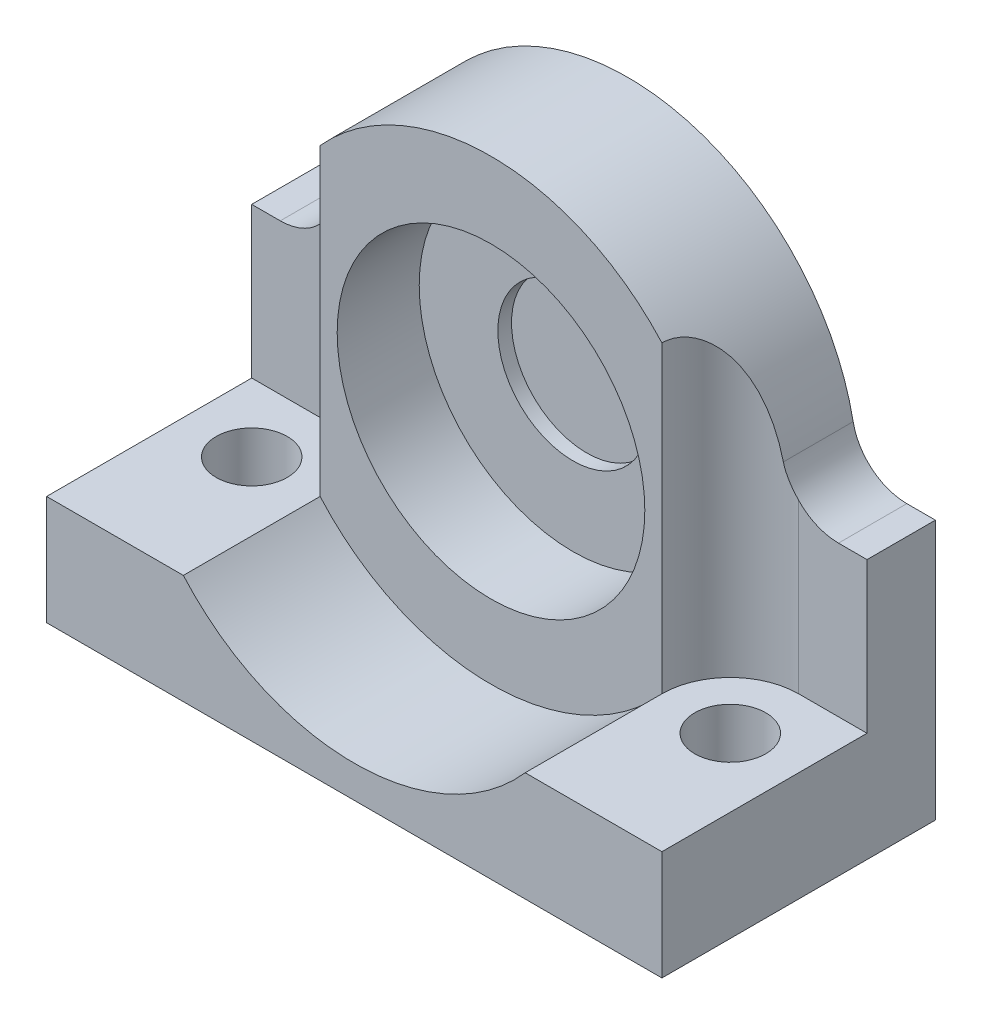
ISO-10303-21;
HEADER;
FILE_DESCRIPTION(('STEP AP214'),'2;1');
FILE_NAME('part.step','',(''),(''),'','','');
FILE_SCHEMA(('AUTOMOTIVE_DESIGN { 1 0 10303 214 1 1 1 1 }'));
ENDSEC;
DATA;
#1=APPLICATION_CONTEXT('core data for automotive mechanical design processes');
#2=APPLICATION_PROTOCOL_DEFINITION('international standard','automotive_design',2000,#1);
#3=PRODUCT_CONTEXT('',#1,'mechanical');
#4=PRODUCT('Part','Part','',(#3));
#5=PRODUCT_RELATED_PRODUCT_CATEGORY('part','',(#4));
#6=PRODUCT_DEFINITION_FORMATION('','',#4);
#7=PRODUCT_DEFINITION_CONTEXT('part definition',#1,'design');
#8=PRODUCT_DEFINITION('design','',#6,#7);
#9=PRODUCT_DEFINITION_SHAPE('','',#8);
#10=(LENGTH_UNIT() NAMED_UNIT(*) SI_UNIT(.MILLI.,.METRE.));
#11=(NAMED_UNIT(*) PLANE_ANGLE_UNIT() SI_UNIT($,.RADIAN.));
#12=(NAMED_UNIT(*) SI_UNIT($,.STERADIAN.) SOLID_ANGLE_UNIT());
#13=UNCERTAINTY_MEASURE_WITH_UNIT(LENGTH_MEASURE(1.E-05),#10,'distance_accuracy_value','');
#14=(GEOMETRIC_REPRESENTATION_CONTEXT(3) GLOBAL_UNCERTAINTY_ASSIGNED_CONTEXT((#13)) GLOBAL_UNIT_ASSIGNED_CONTEXT((#10,
#11,#12)) REPRESENTATION_CONTEXT('',''));
#15=CARTESIAN_POINT('',(0.,0.,0.));
#16=DIRECTION('',(0.,0.,1.));
#17=DIRECTION('',(1.,0.,0.));
#18=AXIS2_PLACEMENT_3D('',#15,#16,#17);
#19=CARTESIAN_POINT('',(0.,19.,20.));
#20=DIRECTION('',(0.,0.,1.));
#21=DIRECTION('',(1.,0.,0.));
#22=AXIS2_PLACEMENT_3D('',#19,#20,#21);
#23=PLANE('',#22);
#24=DIRECTION('',(1.,0.,0.));
#25=VECTOR('',#24,1.);
#26=CARTESIAN_POINT('',(-22.5,8.,20.));
#27=LINE('',#26,#25);
#28=CARTESIAN_POINT('',(12.5,8.,20.));
#29=VERTEX_POINT('',#28);
#30=CARTESIAN_POINT('',(22.5,8.,20.));
#31=VERTEX_POINT('',#30);
#32=EDGE_CURVE('E157',#29,#31,#27,.T.);
#33=ORIENTED_EDGE('',*,*,#32,.F.);
#34=CARTESIAN_POINT('',(0.,19.,20.));
#35=DIRECTION('',(0.,0.,1.));
#36=DIRECTION('',(1.,0.,0.));
#37=AXIS2_PLACEMENT_3D('',#34,#35,#36);
#38=CIRCLE('',#37,16.6508258053467);
#39=CARTESIAN_POINT('',(-12.5,8.,20.));
#40=VERTEX_POINT('',#39);
#41=EDGE_CURVE('E141',#40,#29,#38,.T.);
#42=ORIENTED_EDGE('',*,*,#41,.F.);
#43=CARTESIAN_POINT('',(-22.5,8.,20.));
#44=VERTEX_POINT('',#43);
#45=EDGE_CURVE('E167',#44,#40,#27,.T.);
#46=ORIENTED_EDGE('',*,*,#45,.F.);
#47=DIRECTION('',(0.,-1.,0.));
#48=VECTOR('',#47,1.);
#49=CARTESIAN_POINT('',(-22.5,19.,20.));
#50=LINE('',#49,#48);
#51=CARTESIAN_POINT('',(-22.5,0.,20.));
#52=VERTEX_POINT('',#51);
#53=EDGE_CURVE('E182',#44,#52,#50,.T.);
#54=ORIENTED_EDGE('',*,*,#53,.T.);
#55=DIRECTION('',(1.,0.,0.));
#56=VECTOR('',#55,1.);
#57=CARTESIAN_POINT('',(-22.5,0.,20.));
#58=LINE('',#57,#56);
#59=CARTESIAN_POINT('',(22.5,0.,20.));
#60=VERTEX_POINT('',#59);
#61=EDGE_CURVE('E178',#52,#60,#58,.T.);
#62=ORIENTED_EDGE('',*,*,#61,.T.);
#63=DIRECTION('',(0.,1.,0.));
#64=VECTOR('',#63,1.);
#65=CARTESIAN_POINT('',(22.5,0.,20.));
#66=LINE('',#65,#64);
#67=EDGE_CURVE('E166',#60,#31,#66,.T.);
#68=ORIENTED_EDGE('',*,*,#67,.T.);
#69=EDGE_LOOP('',(#33,#42,#46,#54,#62,#68));
#70=FACE_BOUND('',#69,.T.);
#71=ADVANCED_FACE('F35',(#70),#23,.T.);
#72=CARTESIAN_POINT('',(-22.5,8.,10.));
#73=DIRECTION('',(0.,-1.,0.));
#74=DIRECTION('',(0.,0.,-1.));
#75=AXIS2_PLACEMENT_3D('',#72,#73,#74);
#76=PLANE('',#75);
#77=CARTESIAN_POINT('',(-17.5,8.,10.));
#78=DIRECTION('',(0.,1.,0.));
#79=DIRECTION('',(0.,0.,1.));
#80=AXIS2_PLACEMENT_3D('',#77,#78,#79);
#81=CIRCLE('',#80,2.6);
#82=CARTESIAN_POINT('',(-17.5,8.,12.6));
#83=VERTEX_POINT('',#82);
#84=EDGE_CURVE('E331',#83,#83,#81,.T.);
#85=ORIENTED_EDGE('',*,*,#84,.F.);
#86=EDGE_LOOP('',(#85));
#87=FACE_BOUND('',#86,.T.);
#88=DIRECTION('',(0.,0.,-1.));
#89=VECTOR('',#88,1.);
#90=CARTESIAN_POINT('',(-12.5,8.,20.));
#91=LINE('',#90,#89);
#92=CARTESIAN_POINT('',(-12.5,8.,9.99999999999999));
#93=VERTEX_POINT('',#92);
#94=EDGE_CURVE('E147',#40,#93,#91,.T.);
#95=ORIENTED_EDGE('',*,*,#94,.T.);
#96=CARTESIAN_POINT('',(-17.5,8.,10.));
#97=DIRECTION('',(0.,1.,0.));
#98=DIRECTION('',(0.,0.,1.));
#99=AXIS2_PLACEMENT_3D('',#96,#97,#98);
#100=CIRCLE('',#99,5.);
#101=CARTESIAN_POINT('',(-17.5,8.,5.));
#102=VERTEX_POINT('',#101);
#103=EDGE_CURVE('E337',#93,#102,#100,.T.);
#104=ORIENTED_EDGE('',*,*,#103,.T.);
#105=DIRECTION('',(-1.,0.,0.));
#106=VECTOR('',#105,1.);
#107=CARTESIAN_POINT('',(-17.5,8.,5.));
#108=LINE('',#107,#106);
#109=CARTESIAN_POINT('',(-22.5,8.,5.));
#110=VERTEX_POINT('',#109);
#111=EDGE_CURVE('E342',#102,#110,#108,.T.);
#112=ORIENTED_EDGE('',*,*,#111,.T.);
#113=DIRECTION('',(0.,0.,-1.));
#114=VECTOR('',#113,1.);
#115=CARTESIAN_POINT('',(-22.5,8.,10.));
#116=LINE('',#115,#114);
#117=EDGE_CURVE('E168',#44,#110,#116,.T.);
#118=ORIENTED_EDGE('',*,*,#117,.F.);
#119=ORIENTED_EDGE('',*,*,#45,.T.);
#120=EDGE_LOOP('',(#95,#104,#112,#118,#119));
#121=FACE_BOUND('',#120,.T.);
#122=ADVANCED_FACE('F348',(#87,#121),#76,.F.);
#123=CARTESIAN_POINT('',(17.5,8.,10.));
#124=DIRECTION('',(0.,1.,0.));
#125=DIRECTION('',(0.,0.,1.));
#126=AXIS2_PLACEMENT_3D('',#123,#124,#125);
#127=CIRCLE('',#126,2.6);
#128=CARTESIAN_POINT('',(17.5,8.,12.6));
#129=VERTEX_POINT('',#128);
#130=EDGE_CURVE('E162',#129,#129,#127,.T.);
#131=ORIENTED_EDGE('',*,*,#130,.F.);
#132=EDGE_LOOP('',(#131));
#133=FACE_BOUND('',#132,.T.);
#134=DIRECTION('',(0.,0.,-1.));
#135=VECTOR('',#134,1.);
#136=CARTESIAN_POINT('',(12.5,8.,20.));
#137=LINE('',#136,#135);
#138=CARTESIAN_POINT('',(12.5,8.,9.99999999999999));
#139=VERTEX_POINT('',#138);
#140=EDGE_CURVE('E144',#29,#139,#137,.T.);
#141=ORIENTED_EDGE('',*,*,#140,.F.);
#142=ORIENTED_EDGE('',*,*,#32,.T.);
#143=DIRECTION('',(0.,0.,-1.));
#144=VECTOR('',#143,1.);
#145=CARTESIAN_POINT('',(22.5,8.,10.));
#146=LINE('',#145,#144);
#147=CARTESIAN_POINT('',(22.5,8.,5.));
#148=VERTEX_POINT('',#147);
#149=EDGE_CURVE('E171',#31,#148,#146,.T.);
#150=ORIENTED_EDGE('',*,*,#149,.T.);
#151=DIRECTION('',(-1.,0.,0.));
#152=VECTOR('',#151,1.);
#153=CARTESIAN_POINT('',(17.5,8.,5.));
#154=LINE('',#153,#152);
#155=CARTESIAN_POINT('',(17.5,8.,5.));
#156=VERTEX_POINT('',#155);
#157=EDGE_CURVE('E312',#148,#156,#154,.T.);
#158=ORIENTED_EDGE('',*,*,#157,.T.);
#159=CARTESIAN_POINT('',(17.5,8.,10.));
#160=DIRECTION('',(0.,1.,0.));
#161=DIRECTION('',(0.,0.,1.));
#162=AXIS2_PLACEMENT_3D('',#159,#160,#161);
#163=CIRCLE('',#162,5.);
#164=EDGE_CURVE('E160',#156,#139,#163,.T.);
#165=ORIENTED_EDGE('',*,*,#164,.T.);
#166=EDGE_LOOP('',(#141,#142,#150,#158,#165));
#167=FACE_BOUND('',#166,.T.);
#168=ADVANCED_FACE('F156',(#133,#167),#76,.F.);
#169=CARTESIAN_POINT('',(0.,19.,20.));
#170=DIRECTION('',(0.,0.,-1.));
#171=DIRECTION('',(-1.,0.,0.));
#172=AXIS2_PLACEMENT_3D('',#169,#170,#171);
#173=CYLINDRICAL_SURFACE('',#172,16.8);
#174=CARTESIAN_POINT('',(16.8,19.,5.04924248220538));
#175=CARTESIAN_POINT('',(16.8000022174035,19.2106562323187,5.04926310008381));
#176=CARTESIAN_POINT('',(16.7960379302087,19.4213130539046,5.04980344569116));
#177=CARTESIAN_POINT('',(16.7801919407498,19.842327579965,5.05207154890843));
#178=CARTESIAN_POINT('',(16.7683100362199,20.0526852766604,5.05379933685313));
#179=CARTESIAN_POINT('',(16.7366281814743,20.4730057347984,5.05859275035779));
#180=CARTESIAN_POINT('',(16.7168201289396,20.6829678705503,5.06165974518417));
#181=CARTESIAN_POINT('',(16.6693187818816,21.101966557863,5.06942681995495));
#182=CARTESIAN_POINT('',(16.6416255644162,21.3110031184487,5.07412688394026));
#183=CARTESIAN_POINT('',(16.5781207847793,21.7296769905512,5.08561412508738));
#184=CARTESIAN_POINT('',(16.5422395751883,21.9393032590099,5.09241939695503));
#185=CARTESIAN_POINT('',(16.4625670636126,22.3569447297035,5.10864170888744));
#186=CARTESIAN_POINT('',(16.4187758559397,22.5649599511162,5.11805871781288));
#187=CARTESIAN_POINT('',(16.3234000082937,22.9789064119948,5.14016371472516));
#188=CARTESIAN_POINT('',(16.2718196122779,23.1848387215432,5.1528499241236));
#189=CARTESIAN_POINT('',(16.1609800954177,23.5943128957918,5.18229194656679));
#190=CARTESIAN_POINT('',(16.1017216631907,23.7978549730808,5.19904739477279));
#191=CARTESIAN_POINT('',(15.9594439259016,24.2542407808837,5.2425244978682));
#192=CARTESIAN_POINT('',(15.8742368543149,24.5062716426994,5.27070174641411));
#193=CARTESIAN_POINT('',(15.692419866259,25.0048613808331,5.33716569885362));
#194=CARTESIAN_POINT('',(15.5958097034524,25.2514201388023,5.37545262116554));
#195=CARTESIAN_POINT('',(15.3922373127309,25.7370725663408,5.4646219789778));
#196=CARTESIAN_POINT('',(15.2853059729389,25.9761858413195,5.51546750131636));
#197=CARTESIAN_POINT('',(15.0620171746626,26.4460184922372,5.63283220428173));
#198=CARTESIAN_POINT('',(14.9456630889963,26.6767408291876,5.69934579274382));
#199=CARTESIAN_POINT('',(14.742616857047,27.0576886899802,5.82789788222401));
#200=CARTESIAN_POINT('',(14.6579240281916,27.2106768209981,5.88492055078757));
#201=CARTESIAN_POINT('',(14.4857540886923,27.5107473358665,6.00931026923488));
#202=CARTESIAN_POINT('',(14.398277761505,27.6578313556132,6.07667442841675));
#203=CARTESIAN_POINT('',(14.2216857827144,27.9449436181785,6.22299214759612));
#204=CARTESIAN_POINT('',(14.1325715863451,28.0849777468347,6.30193581705451));
#205=CARTESIAN_POINT('',(13.9541242260709,28.3567553148466,6.4726766353393));
#206=CARTESIAN_POINT('',(13.8647911531225,28.4885017374337,6.56446912030554));
#207=CARTESIAN_POINT('',(13.6493423591988,28.7971614343789,6.80491268376906));
#208=CARTESIAN_POINT('',(13.524014344853,28.9689893520079,6.96099259491178));
#209=CARTESIAN_POINT('',(13.2837503279058,29.2869666445771,7.30426411441287));
#210=CARTESIAN_POINT('',(13.1688020733901,29.4331464911258,7.49141828262399));
#211=CARTESIAN_POINT('',(12.9777786062212,29.6693943726013,7.85897829065417));
#212=CARTESIAN_POINT('',(12.8984493570044,29.7648417858504,8.03417103026052));
#213=CARTESIAN_POINT('',(12.7931306125583,29.889387944679,8.31029112895761));
#214=CARTESIAN_POINT('',(12.7603110647416,29.9277907594167,8.40452383206018));
#215=CARTESIAN_POINT('',(12.6998223670579,29.9980297643355,8.59698556807777));
#216=CARTESIAN_POINT('',(12.6721508940457,30.029868917171,8.69521277390869));
#217=CARTESIAN_POINT('',(12.6235753753868,30.0854252177871,8.89085063381169));
#218=CARTESIAN_POINT('',(12.6024355820496,30.1094277279501,8.98812176026573));
#219=CARTESIAN_POINT('',(12.5658347357404,30.1508096748813,9.18510746707088));
#220=CARTESIAN_POINT('',(12.5503730363718,30.1681898655456,9.28482176791049));
#221=CARTESIAN_POINT('',(12.5253795672312,30.1962155966797,9.48663688643726));
#222=CARTESIAN_POINT('',(12.5158890645093,30.2068142783601,9.58874935986645));
#223=CARTESIAN_POINT('',(12.503184982129,30.2209795027709,9.79390374279725));
#224=CARTESIAN_POINT('',(12.4999748706758,30.224542160025,9.89694613429218));
#225=CARTESIAN_POINT('',(12.5,30.2245267160803,10.));
#226=B_SPLINE_CURVE_WITH_KNOTS('',3,(#174,#175,#176,#177,#178,#179,#180,#181,#182,#183,#184,
#185,#186,#187,#188,#189,#190,#191,#192,#193,#194,#195,#196,#197,#198,#199,#200,#201,#202,#203,
#204,#205,#206,#207,#208,#209,#210,#211,#212,#213,#214,#215,#216,#217,#218,#219,#220,#221,#222,
#223,#224,#225),.UNSPECIFIED.,.F.,.F.,(4,2,2,2,2,2,2,2,2,2,2,2,2,2,2,2,2,2,2,2,2,2,2,2,2,4),(0.,
0.631931673888826,1.26387949191054,1.89647496083364,2.5290642479192,3.16724938534757,
3.80542691412355,4.44325797665167,5.0810318737854,5.88316950786804,6.68532447345974,
7.48514917314037,8.28468883492694,8.83612876044261,9.38741482461139,9.93823272530735,
10.4888512062223,11.2774201854008,12.0650458532915,12.7062545528556,13.0266737284764,
13.3469479575878,13.6537469985599,13.960511102563,14.269372621225,14.5784046536431),.UNSPECIFIED.);
#227=CARTESIAN_POINT('',(16.4864226009621,22.2307692307692,5.10381159919682));
#228=VERTEX_POINT('',#227);
#229=CARTESIAN_POINT('',(12.5,30.2245267160803,10.));
#230=VERTEX_POINT('',#229);
#231=EDGE_CURVE('E248',#228,#230,#226,.T.);
#232=ORIENTED_EDGE('',*,*,#231,.F.);
#233=DIRECTION('',(0.,0.,-1.));
#234=VECTOR('',#233,1.);
#235=CARTESIAN_POINT('',(16.4864226009621,22.2307692307692,20.));
#236=LINE('',#235,#234);
#237=CARTESIAN_POINT('',(16.4864226009621,22.2307692307692,0.));
#238=VERTEX_POINT('',#237);
#239=EDGE_CURVE('E214',#228,#238,#236,.T.);
#240=ORIENTED_EDGE('',*,*,#239,.T.);
#241=CARTESIAN_POINT('',(0.,19.,0.));
#242=DIRECTION('',(0.,0.,1.));
#243=DIRECTION('',(1.,0.,0.));
#244=AXIS2_PLACEMENT_3D('',#241,#242,#243);
#245=CIRCLE('',#244,16.8);
#246=CARTESIAN_POINT('',(-16.4864226009621,22.2307692307692,0.));
#247=VERTEX_POINT('',#246);
#248=EDGE_CURVE('E192',#238,#247,#245,.T.);
#249=ORIENTED_EDGE('',*,*,#248,.T.);
#250=DIRECTION('',(0.,0.,-1.));
#251=VECTOR('',#250,1.);
#252=CARTESIAN_POINT('',(-16.4864226009621,22.2307692307692,20.));
#253=LINE('',#252,#251);
#254=CARTESIAN_POINT('',(-16.4864226009621,22.2307692307692,5.10381159919682));
#255=VERTEX_POINT('',#254);
#256=EDGE_CURVE('E212',#247,#255,#253,.F.);
#257=ORIENTED_EDGE('',*,*,#256,.T.);
#258=CARTESIAN_POINT('',(-12.5,30.2245267160803,10.));
#259=CARTESIAN_POINT('',(-12.4999739699613,30.2245427358931,9.89606180736173));
#260=CARTESIAN_POINT('',(-12.5032398428034,30.2209183985782,9.79213543472624));
#261=CARTESIAN_POINT('',(-12.5161623801299,30.2065092810273,9.58523458610509));
#262=CARTESIAN_POINT('',(-12.5258156110656,30.1957283478366,9.48225962882129));
#263=CARTESIAN_POINT('',(-12.5512327001198,30.1672242373879,9.27877709205917));
#264=CARTESIAN_POINT('',(-12.5669541603657,30.1495492193138,9.17825742816001));
#265=CARTESIAN_POINT('',(-12.6041615430671,30.1074706680418,8.97972371076031));
#266=CARTESIAN_POINT('',(-12.6256479396121,30.0830665814626,8.88170986405645));
#267=CARTESIAN_POINT('',(-12.67389581632,30.0278602594383,8.6890621310449));
#268=CARTESIAN_POINT('',(-12.7006466637058,29.9970709138654,8.59442187873103));
#269=CARTESIAN_POINT('',(-12.7589324261738,29.9293932919524,8.40885176253122));
#270=CARTESIAN_POINT('',(-12.7904692278386,29.8925026099997,8.31792337984921));
#271=CARTESIAN_POINT('',(-12.8914826869836,29.7731398656913,8.05124148553034));
#272=CARTESIAN_POINT('',(-12.9673371784462,29.6820054033456,7.88168856193681));
#273=CARTESIAN_POINT('',(-13.1568536705853,29.4482624275622,7.511445079659));
#274=CARTESIAN_POINT('',(-13.2749199188086,29.298469803461,7.31760473987943));
#275=CARTESIAN_POINT('',(-13.5222119998096,28.9715504462514,6.96287117194728));
#276=CARTESIAN_POINT('',(-13.6514557828249,28.7943793726325,6.80203239263921));
#277=CARTESIAN_POINT('',(-13.8770500621888,28.4707501907894,6.55118720590684));
#278=CARTESIAN_POINT('',(-13.972649750246,28.3292837043825,6.45387570394074));
#279=CARTESIAN_POINT('',(-14.1634275412248,28.0370211668214,6.27380932356499));
#280=CARTESIAN_POINT('',(-14.2586054323998,27.886220897581,6.19106109241927));
#281=CARTESIAN_POINT('',(-14.446893791159,27.5767202758502,6.03852965091304));
#282=CARTESIAN_POINT('',(-14.5400014307972,27.4180099748085,5.96876331785296));
#283=CARTESIAN_POINT('',(-14.7227879923495,27.094081207383,5.84072907945759));
#284=CARTESIAN_POINT('',(-14.8124656938489,26.9288604661844,5.78246523672222));
#285=CARTESIAN_POINT('',(-15.0437903416631,26.4847285755243,5.64161984437316));
#286=CARTESIAN_POINT('',(-15.1816959993833,26.2011501750408,5.56755530525243));
#287=CARTESIAN_POINT('',(-15.4428185066767,25.6227100505359,5.44049681488315));
#288=CARTESIAN_POINT('',(-15.5660259224349,25.3278412386119,5.38751634567591));
#289=CARTESIAN_POINT('',(-15.7962976439909,24.7288855528762,5.29758643677212));
#290=CARTESIAN_POINT('',(-15.9033306595192,24.4247821446458,5.26066781690565));
#291=CARTESIAN_POINT('',(-16.0999834170937,23.8098594275256,5.19889857218544));
#292=CARTESIAN_POINT('',(-16.1896046073273,23.49904067956,5.17404694343016));
#293=CARTESIAN_POINT('',(-16.3271024191406,22.9645768420148,5.13916410584225));
#294=CARTESIAN_POINT('',(-16.3794996274975,22.742219280419,5.1269236660341));
#295=CARTESIAN_POINT('',(-16.4752146769837,22.2953760453936,5.10589919389443));
#296=CARTESIAN_POINT('',(-16.5185318892034,22.0708902256789,5.09711540094436));
#297=CARTESIAN_POINT('',(-16.5959908899643,21.6201888562,5.08224431191057));
#298=CARTESIAN_POINT('',(-16.6301299607785,21.3939728144502,5.07615781417415));
#299=CARTESIAN_POINT('',(-16.6891465718788,20.9402873692849,5.06609555556874));
#300=CARTESIAN_POINT('',(-16.714024003156,20.7128179511491,5.06211981954303));
#301=CARTESIAN_POINT('',(-16.7544899481542,20.2567904322385,5.05584848233163));
#302=CARTESIAN_POINT('',(-16.7700686395614,20.0282314364204,5.05355465717633));
#303=CARTESIAN_POINT('',(-16.79186747182,19.5706570698729,5.05038692281363));
#304=CARTESIAN_POINT('',(-16.7980875695513,19.3416416970455,5.04951302014859));
#305=CARTESIAN_POINT('',(-16.8011575455625,18.8835864007917,5.04907870866533));
#306=CARTESIAN_POINT('',(-16.7980090380658,18.6545464883933,5.04951807356941));
#307=CARTESIAN_POINT('',(-16.7823510475034,18.196794935913,5.05176370065137));
#308=CARTESIAN_POINT('',(-16.7698416255934,17.9680832936963,5.05356995389927));
#309=CARTESIAN_POINT('',(-16.7353442111614,17.5095119919696,5.05878469222967));
#310=CARTESIAN_POINT('',(-16.7132795438959,17.2796582389118,5.06220615881956));
#311=CARTESIAN_POINT('',(-16.6597010916807,16.8210901024455,5.07104118451555));
#312=CARTESIAN_POINT('',(-16.6281872315241,16.59237572812,5.07645475947703));
#313=CARTESIAN_POINT('',(-16.5557597111807,16.1364132807963,5.08983021040194));
#314=CARTESIAN_POINT('',(-16.5148420680026,15.9091658711837,5.09779316672429));
#315=CARTESIAN_POINT('',(-16.4237073793192,15.4566830673455,5.11699239419239));
#316=CARTESIAN_POINT('',(-16.3734904907232,15.2314476392381,5.12822861010915));
#317=CARTESIAN_POINT('',(-16.2640679932112,14.7842066263594,5.15483410936464));
#318=CARTESIAN_POINT('',(-16.2048927635286,14.5621928042746,5.1701895546653));
#319=CARTESIAN_POINT('',(-16.0776068513413,14.121143704133,5.20613174864078));
#320=CARTESIAN_POINT('',(-16.0094955325337,13.9021086394085,5.2267188699401));
#321=CARTESIAN_POINT('',(-15.8646651803605,13.4678453163411,5.27437968018739));
#322=CARTESIAN_POINT('',(-15.7879545338135,13.2526135818396,5.30144707777068));
#323=CARTESIAN_POINT('',(-15.6262509194742,12.8264931735593,5.36356082435413));
#324=CARTESIAN_POINT('',(-15.5412600253099,12.6156034283565,5.39860517860264));
#325=CARTESIAN_POINT('',(-15.3754629736778,12.2269969730098,5.47303120849863));
#326=CARTESIAN_POINT('',(-15.2956307730737,12.0486326519301,5.5111960710757));
#327=CARTESIAN_POINT('',(-15.1306309945438,11.6964525868054,5.59605865081777));
#328=CARTESIAN_POINT('',(-15.0454638554817,11.5226364702785,5.64275566671331));
#329=CARTESIAN_POINT('',(-14.8704821858906,11.180430095941,5.7460658212536));
#330=CARTESIAN_POINT('',(-14.7806693370824,11.0120379100247,5.80267538906657));
#331=CARTESIAN_POINT('',(-14.5972800711877,10.6816415800619,5.92734594443976));
#332=CARTESIAN_POINT('',(-14.503704151578,10.5196365972005,5.99540542208766));
#333=CARTESIAN_POINT('',(-14.3289095691852,10.2280818937106,6.13289162423551));
#334=CARTESIAN_POINT('',(-14.2480543189134,10.0974266598205,6.20043016941544));
#335=CARTESIAN_POINT('',(-14.0855259014918,9.84244510438478,6.3457890903927));
#336=CARTESIAN_POINT('',(-14.0038526838479,9.71811917647293,6.42361010460021));
#337=CARTESIAN_POINT('',(-13.8410008399737,9.47698432602586,6.59041258815533));
#338=CARTESIAN_POINT('',(-13.7598218445617,9.36016894317108,6.6793842663715));
#339=CARTESIAN_POINT('',(-13.5995008189696,9.1352812449459,6.86925542551089));
#340=CARTESIAN_POINT('',(-13.5203579149667,9.02720513480347,6.97014968205126));
#341=CARTESIAN_POINT('',(-13.333224678338,8.77754900534217,7.22994192736218));
#342=CARTESIAN_POINT('',(-13.2271541058861,8.64107588279941,7.39535034621372));
#343=CARTESIAN_POINT('',(-13.0790039695387,8.45552322504422,7.66223467489504));
#344=CARTESIAN_POINT('',(-13.031487590795,8.39691306328859,7.75422583589236));
#345=CARTESIAN_POINT('',(-12.9409211645737,8.28656790860155,7.94430972269816));
#346=CARTESIAN_POINT('',(-12.8978686510853,8.23482911517625,8.04239903122586));
#347=CARTESIAN_POINT('',(-12.8277898520462,8.15150017608685,8.21762614735212));
#348=CARTESIAN_POINT('',(-12.7995322934328,8.11819577278527,8.29346302950409));
#349=CARTESIAN_POINT('',(-12.7462588545191,8.05584366150846,8.44801967009795));
#350=CARTESIAN_POINT('',(-12.7212446583936,8.02679816403091,8.52674089929445));
#351=CARTESIAN_POINT('',(-12.69803134348,8.,8.6067674200625));
#352=B_SPLINE_CURVE_WITH_KNOTS('',3,(#258,#259,#260,#261,#262,#263,#264,#265,#266,#267,#268,
#269,#270,#271,#272,#273,#274,#275,#276,#277,#278,#279,#280,#281,#282,#283,#284,#285,#286,#287,
#288,#289,#290,#291,#292,#293,#294,#295,#296,#297,#298,#299,#300,#301,#302,#303,#304,#305,#306,
#307,#308,#309,#310,#311,#312,#313,#314,#315,#316,#317,#318,#319,#320,#321,#322,#323,#324,#325,
#326,#327,#328,#329,#330,#331,#332,#333,#334,#335,#336,#337,#338,#339,#340,#341,#342,#343,#344,
#345,#346,#347,#348,#349,#350,#351),.UNSPECIFIED.,.F.,.F.,(4,2,2,2,2,2,2,2,2,2,2,2,2,2,2,2,2,2,
2,2,2,2,2,2,2,2,2,2,2,2,2,2,2,2,2,2,2,2,2,2,2,2,2,2,2,2,4),(0.,0.311681619257336,
0.623195828842086,0.932571818846448,1.24197325872963,1.55075608825419,1.85966095505275,
2.47778026637495,3.28925028457892,4.10204855778921,4.6908514968849,5.27992249627807,
5.86975405533332,6.45979356756916,7.42997551538007,8.40077684534609,9.37343284155405,
10.346007904727,11.0321313935073,11.7183023896998,12.404676343832,13.0910583762803,
13.7781641608956,14.4652731113726,15.1522636789115,15.8392497583294,16.5318536853906,
17.2244631250802,17.9173664633023,18.6102581109949,19.3008506092557,19.9914923085458,
20.6814661993278,21.3712677414887,21.9683169278466,22.5653170639649,23.1621025815032,
23.7588094618735,24.261940398299,24.7651025874301,25.2678260173188,25.770329968859,
26.4848811879269,26.8414614971966,27.1978437562876,27.4601909361237,27.7226738035146),.UNSPECIFIED.);
#353=CARTESIAN_POINT('',(-12.5,30.2245267160803,10.));
#354=VERTEX_POINT('',#353);
#355=EDGE_CURVE('E273',#354,#255,#352,.T.);
#356=ORIENTED_EDGE('',*,*,#355,.F.);
#357=CARTESIAN_POINT('',(0.,19.,10.));
#358=DIRECTION('',(0.,0.,-1.));
#359=DIRECTION('',(0.,1.,0.));
#360=AXIS2_PLACEMENT_3D('',#357,#358,#359);
#361=CIRCLE('',#360,16.8);
#362=EDGE_CURVE('E170',#354,#230,#361,.T.);
#363=ORIENTED_EDGE('',*,*,#362,.T.);
#364=EDGE_LOOP('',(#232,#240,#249,#257,#356,#363));
#365=FACE_BOUND('',#364,.T.);
#366=ADVANCED_FACE('F260',(#365),#173,.T.);
#367=CARTESIAN_POINT('',(-22.5,35.8,10.));
#368=DIRECTION('',(0.,0.,-1.));
#369=DIRECTION('',(0.,1.,0.));
#370=AXIS2_PLACEMENT_3D('',#367,#368,#369);
#371=PLANE('',#370);
#372=CARTESIAN_POINT('',(0.,19.,9.99999999999999));
#373=DIRECTION('',(0.,0.,1.));
#374=DIRECTION('',(1.,0.,0.));
#375=AXIS2_PLACEMENT_3D('',#372,#373,#374);
#376=CIRCLE('',#375,16.6508258053467);
#377=EDGE_CURVE('E152',#93,#139,#376,.T.);
#378=ORIENTED_EDGE('',*,*,#377,.T.);
#379=DIRECTION('',(0.,-1.,0.));
#380=VECTOR('',#379,1.);
#381=CARTESIAN_POINT('',(12.5,35.8,10.));
#382=LINE('',#381,#380);
#383=EDGE_CURVE('E256',#230,#139,#382,.T.);
#384=ORIENTED_EDGE('',*,*,#383,.F.);
#385=ORIENTED_EDGE('',*,*,#362,.F.);
#386=DIRECTION('',(0.,-1.,0.));
#387=VECTOR('',#386,1.);
#388=CARTESIAN_POINT('',(-12.5,35.8,10.));
#389=LINE('',#388,#387);
#390=EDGE_CURVE('E324',#354,#93,#389,.T.);
#391=ORIENTED_EDGE('',*,*,#390,.T.);
#392=EDGE_LOOP('',(#378,#384,#385,#391));
#393=FACE_BOUND('',#392,.T.);
#394=CARTESIAN_POINT('',(0.,19.,9.99999999999999));
#395=DIRECTION('',(0.,0.,1.));
#396=DIRECTION('',(1.,0.,0.));
#397=AXIS2_PLACEMENT_3D('',#394,#395,#396);
#398=CIRCLE('',#397,11.25);
#399=CARTESIAN_POINT('',(11.25,19.,9.99999999999999));
#400=VERTEX_POINT('',#399);
#401=EDGE_CURVE('E362',#400,#400,#398,.T.);
#402=ORIENTED_EDGE('',*,*,#401,.F.);
#403=EDGE_LOOP('',(#402));
#404=FACE_BOUND('',#403,.T.);
#405=ADVANCED_FACE('F265',(#393,#404),#371,.F.);
#406=CARTESIAN_POINT('',(-16.8,19.,20.));
#407=DIRECTION('',(0.,-1.,0.));
#408=DIRECTION('',(1.,0.,0.));
#409=AXIS2_PLACEMENT_3D('',#406,#407,#408);
#410=PLANE('',#409);
#411=DIRECTION('',(-1.,0.,0.));
#412=VECTOR('',#411,1.);
#413=CARTESIAN_POINT('',(-16.8,19.,5.));
#414=LINE('',#413,#412);
#415=CARTESIAN_POINT('',(-20.4117613154769,19.,5.));
#416=VERTEX_POINT('',#415);
#417=CARTESIAN_POINT('',(-22.5,19.,5.));
#418=VERTEX_POINT('',#417);
#419=EDGE_CURVE('E280',#416,#418,#414,.T.);
#420=ORIENTED_EDGE('',*,*,#419,.F.);
#421=DIRECTION('',(0.,0.,1.));
#422=VECTOR('',#421,1.);
#423=CARTESIAN_POINT('',(-20.4117613154769,19.,0.));
#424=LINE('',#423,#422);
#425=CARTESIAN_POINT('',(-20.4117613154769,19.,0.));
#426=VERTEX_POINT('',#425);
#427=EDGE_CURVE('E219',#416,#426,#424,.F.);
#428=ORIENTED_EDGE('',*,*,#427,.T.);
#429=DIRECTION('',(-1.,0.,0.));
#430=VECTOR('',#429,1.);
#431=CARTESIAN_POINT('',(-16.8,19.,0.));
#432=LINE('',#431,#430);
#433=CARTESIAN_POINT('',(-22.5,19.,0.));
#434=VERTEX_POINT('',#433);
#435=EDGE_CURVE('E195',#426,#434,#432,.T.);
#436=ORIENTED_EDGE('',*,*,#435,.T.);
#437=DIRECTION('',(0.,0.,-1.));
#438=VECTOR('',#437,1.);
#439=CARTESIAN_POINT('',(-22.5,19.,20.));
#440=LINE('',#439,#438);
#441=EDGE_CURVE('E201',#418,#434,#440,.T.);
#442=ORIENTED_EDGE('',*,*,#441,.F.);
#443=EDGE_LOOP('',(#420,#428,#436,#442));
#444=FACE_BOUND('',#443,.T.);
#445=ADVANCED_FACE('F267',(#444),#410,.F.);
#446=CARTESIAN_POINT('',(-22.5,19.,20.));
#447=DIRECTION('',(1.,0.,0.));
#448=DIRECTION('',(0.,1.,0.));
#449=AXIS2_PLACEMENT_3D('',#446,#447,#448);
#450=PLANE('',#449);
#451=DIRECTION('',(0.,-1.,0.));
#452=VECTOR('',#451,1.);
#453=CARTESIAN_POINT('',(-22.5,35.8,5.));
#454=LINE('',#453,#452);
#455=EDGE_CURVE('E345',#418,#110,#454,.T.);
#456=ORIENTED_EDGE('',*,*,#455,.F.);
#457=ORIENTED_EDGE('',*,*,#441,.T.);
#458=DIRECTION('',(0.,-1.,0.));
#459=VECTOR('',#458,1.);
#460=CARTESIAN_POINT('',(-22.5,19.,0.));
#461=LINE('',#460,#459);
#462=CARTESIAN_POINT('',(-22.5,0.,0.));
#463=VERTEX_POINT('',#462);
#464=EDGE_CURVE('E180',#434,#463,#461,.T.);
#465=ORIENTED_EDGE('',*,*,#464,.T.);
#466=DIRECTION('',(0.,0.,-1.));
#467=VECTOR('',#466,1.);
#468=CARTESIAN_POINT('',(-22.5,0.,20.));
#469=LINE('',#468,#467);
#470=EDGE_CURVE('E184',#52,#463,#469,.T.);
#471=ORIENTED_EDGE('',*,*,#470,.F.);
#472=ORIENTED_EDGE('',*,*,#53,.F.);
#473=ORIENTED_EDGE('',*,*,#117,.T.);
#474=EDGE_LOOP('',(#456,#457,#465,#471,#472,#473));
#475=FACE_BOUND('',#474,.T.);
#476=ADVANCED_FACE('F352',(#475),#450,.F.);
#477=CARTESIAN_POINT('',(22.5,0.,20.));
#478=DIRECTION('',(-1.,0.,0.));
#479=DIRECTION('',(0.,0.,1.));
#480=AXIS2_PLACEMENT_3D('',#477,#478,#479);
#481=PLANE('',#480);
#482=DIRECTION('',(0.,-1.,0.));
#483=VECTOR('',#482,1.);
#484=CARTESIAN_POINT('',(22.5,35.8,5.));
#485=LINE('',#484,#483);
#486=CARTESIAN_POINT('',(22.5,19.,5.));
#487=VERTEX_POINT('',#486);
#488=EDGE_CURVE('E315',#487,#148,#485,.T.);
#489=ORIENTED_EDGE('',*,*,#488,.T.);
#490=ORIENTED_EDGE('',*,*,#149,.F.);
#491=ORIENTED_EDGE('',*,*,#67,.F.);
#492=DIRECTION('',(0.,0.,-1.));
#493=VECTOR('',#492,1.);
#494=CARTESIAN_POINT('',(22.5,0.,20.));
#495=LINE('',#494,#493);
#496=CARTESIAN_POINT('',(22.5,0.,0.));
#497=VERTEX_POINT('',#496);
#498=EDGE_CURVE('E206',#60,#497,#495,.T.);
#499=ORIENTED_EDGE('',*,*,#498,.T.);
#500=DIRECTION('',(0.,1.,0.));
#501=VECTOR('',#500,1.);
#502=CARTESIAN_POINT('',(22.5,0.,0.));
#503=LINE('',#502,#501);
#504=CARTESIAN_POINT('',(22.5,19.,0.));
#505=VERTEX_POINT('',#504);
#506=EDGE_CURVE('E186',#497,#505,#503,.T.);
#507=ORIENTED_EDGE('',*,*,#506,.T.);
#508=DIRECTION('',(0.,0.,-1.));
#509=VECTOR('',#508,1.);
#510=CARTESIAN_POINT('',(22.5,19.,20.));
#511=LINE('',#510,#509);
#512=EDGE_CURVE('E204',#487,#505,#511,.T.);
#513=ORIENTED_EDGE('',*,*,#512,.F.);
#514=EDGE_LOOP('',(#489,#490,#491,#499,#507,#513));
#515=FACE_BOUND('',#514,.T.);
#516=ADVANCED_FACE('F358',(#515),#481,.F.);
#517=CARTESIAN_POINT('',(22.5,19.,20.));
#518=DIRECTION('',(0.,-1.,0.));
#519=DIRECTION('',(1.,0.,0.));
#520=AXIS2_PLACEMENT_3D('',#517,#518,#519);
#521=PLANE('',#520);
#522=DIRECTION('',(-1.,0.,0.));
#523=VECTOR('',#522,1.);
#524=CARTESIAN_POINT('',(22.5,19.,0.));
#525=LINE('',#524,#523);
#526=CARTESIAN_POINT('',(20.4117613154769,19.,0.));
#527=VERTEX_POINT('',#526);
#528=EDGE_CURVE('E189',#505,#527,#525,.T.);
#529=ORIENTED_EDGE('',*,*,#528,.T.);
#530=DIRECTION('',(0.,0.,1.));
#531=VECTOR('',#530,1.);
#532=CARTESIAN_POINT('',(20.4117613154769,19.,5.04924248220538));
#533=LINE('',#532,#531);
#534=CARTESIAN_POINT('',(20.4117613154769,19.,5.));
#535=VERTEX_POINT('',#534);
#536=EDGE_CURVE('E217',#527,#535,#533,.T.);
#537=ORIENTED_EDGE('',*,*,#536,.T.);
#538=DIRECTION('',(-1.,0.,0.));
#539=VECTOR('',#538,1.);
#540=CARTESIAN_POINT('',(22.5,19.,5.));
#541=LINE('',#540,#539);
#542=EDGE_CURVE('E209',#487,#535,#541,.T.);
#543=ORIENTED_EDGE('',*,*,#542,.F.);
#544=ORIENTED_EDGE('',*,*,#512,.T.);
#545=EDGE_LOOP('',(#529,#537,#543,#544));
#546=FACE_BOUND('',#545,.T.);
#547=ADVANCED_FACE('F269',(#546),#521,.F.);
#548=CARTESIAN_POINT('',(0.,0.,20.));
#549=DIRECTION('',(0.,1.,0.));
#550=DIRECTION('',(0.,0.,1.));
#551=AXIS2_PLACEMENT_3D('',#548,#549,#550);
#552=PLANE('',#551);
#553=CARTESIAN_POINT('',(17.5,0.,9.99999999999999));
#554=DIRECTION('',(0.,1.,0.));
#555=DIRECTION('',(0.,0.,1.));
#556=AXIS2_PLACEMENT_3D('',#553,#554,#555);
#557=CIRCLE('',#556,2.6);
#558=CARTESIAN_POINT('',(17.5,0.,12.6));
#559=VERTEX_POINT('',#558);
#560=EDGE_CURVE('E328',#559,#559,#557,.T.);
#561=ORIENTED_EDGE('',*,*,#560,.T.);
#562=EDGE_LOOP('',(#561));
#563=FACE_BOUND('',#562,.T.);
#564=CARTESIAN_POINT('',(-17.5,0.,9.99999999999999));
#565=DIRECTION('',(0.,1.,0.));
#566=DIRECTION('',(0.,0.,1.));
#567=AXIS2_PLACEMENT_3D('',#564,#565,#566);
#568=CIRCLE('',#567,2.6);
#569=CARTESIAN_POINT('',(-17.5,0.,12.6));
#570=VERTEX_POINT('',#569);
#571=EDGE_CURVE('E334',#570,#570,#568,.T.);
#572=ORIENTED_EDGE('',*,*,#571,.T.);
#573=EDGE_LOOP('',(#572));
#574=FACE_BOUND('',#573,.T.);
#575=DIRECTION('',(1.,0.,0.));
#576=VECTOR('',#575,1.);
#577=CARTESIAN_POINT('',(0.,0.,0.));
#578=LINE('',#577,#576);
#579=EDGE_CURVE('E177',#463,#497,#578,.T.);
#580=ORIENTED_EDGE('',*,*,#579,.T.);
#581=ORIENTED_EDGE('',*,*,#498,.F.);
#582=ORIENTED_EDGE('',*,*,#61,.F.);
#583=ORIENTED_EDGE('',*,*,#470,.T.);
#584=EDGE_LOOP('',(#580,#581,#582,#583));
#585=FACE_BOUND('',#584,.T.);
#586=ADVANCED_FACE('F356',(#563,#574,#585),#552,.F.);
#587=CARTESIAN_POINT('',(0.,19.,0.));
#588=DIRECTION('',(0.,0.,1.));
#589=DIRECTION('',(1.,0.,0.));
#590=AXIS2_PLACEMENT_3D('',#587,#588,#589);
#591=PLANE('',#590);
#592=ORIENTED_EDGE('',*,*,#579,.F.);
#593=ORIENTED_EDGE('',*,*,#464,.F.);
#594=ORIENTED_EDGE('',*,*,#435,.F.);
#595=CARTESIAN_POINT('',(-20.4117613154769,23.,0.));
#596=DIRECTION('',(0.,0.,1.));
#597=DIRECTION('',(1.,0.,0.));
#598=AXIS2_PLACEMENT_3D('',#595,#596,#597);
#599=CIRCLE('',#598,4.);
#600=EDGE_CURVE('E232',#426,#247,#599,.T.);
#601=ORIENTED_EDGE('',*,*,#600,.T.);
#602=ORIENTED_EDGE('',*,*,#248,.F.);
#603=CARTESIAN_POINT('',(20.4117613154769,23.,0.));
#604=DIRECTION('',(0.,0.,1.));
#605=DIRECTION('',(1.,0.,0.));
#606=AXIS2_PLACEMENT_3D('',#603,#604,#605);
#607=CIRCLE('',#606,4.);
#608=EDGE_CURVE('E222',#238,#527,#607,.T.);
#609=ORIENTED_EDGE('',*,*,#608,.T.);
#610=ORIENTED_EDGE('',*,*,#528,.F.);
#611=ORIENTED_EDGE('',*,*,#506,.F.);
#612=EDGE_LOOP('',(#592,#593,#594,#601,#602,#609,#610,#611));
#613=FACE_BOUND('',#612,.T.);
#614=ADVANCED_FACE('F299',(#613),#591,.F.);
#615=CARTESIAN_POINT('',(0.,19.,3.99999999999999));
#616=DIRECTION('',(0.,0.,1.));
#617=DIRECTION('',(1.,0.,0.));
#618=AXIS2_PLACEMENT_3D('',#615,#616,#617);
#619=CYLINDRICAL_SURFACE('',#618,11.25);
#620=CARTESIAN_POINT('',(0.,19.,3.99999999999999));
#621=DIRECTION('',(0.,0.,1.));
#622=DIRECTION('',(1.,0.,0.));
#623=AXIS2_PLACEMENT_3D('',#620,#621,#622);
#624=CIRCLE('',#623,11.25);
#625=CARTESIAN_POINT('',(11.25,19.,3.99999999999999));
#626=VERTEX_POINT('',#625);
#627=EDGE_CURVE('E360',#626,#626,#624,.T.);
#628=ORIENTED_EDGE('',*,*,#627,.F.);
#629=EDGE_LOOP('',(#628));
#630=FACE_BOUND('',#629,.T.);
#631=ORIENTED_EDGE('',*,*,#401,.T.);
#632=EDGE_LOOP('',(#631));
#633=FACE_BOUND('',#632,.T.);
#634=ADVANCED_FACE('F382',(#630,#633),#619,.F.);
#635=CARTESIAN_POINT('',(0.,19.,3.99999999999999));
#636=DIRECTION('',(0.,0.,1.));
#637=DIRECTION('',(1.,0.,0.));
#638=AXIS2_PLACEMENT_3D('',#635,#636,#637);
#639=PLANE('',#638);
#640=CARTESIAN_POINT('',(0.,19.,3.99999999999999));
#641=DIRECTION('',(0.,0.,1.));
#642=DIRECTION('',(1.,0.,0.));
#643=AXIS2_PLACEMENT_3D('',#640,#641,#642);
#644=CIRCLE('',#643,5.5);
#645=CARTESIAN_POINT('',(5.5,19.,3.99999999999999));
#646=VERTEX_POINT('',#645);
#647=EDGE_CURVE('E255',#646,#646,#644,.T.);
#648=ORIENTED_EDGE('',*,*,#647,.F.);
#649=EDGE_LOOP('',(#648));
#650=FACE_BOUND('',#649,.T.);
#651=ORIENTED_EDGE('',*,*,#627,.T.);
#652=EDGE_LOOP('',(#651));
#653=FACE_BOUND('',#652,.T.);
#654=ADVANCED_FACE('F377',(#650,#653),#639,.T.);
#655=CARTESIAN_POINT('',(0.,19.,2.99999999999999));
#656=DIRECTION('',(0.,0.,1.));
#657=DIRECTION('',(1.,0.,0.));
#658=AXIS2_PLACEMENT_3D('',#655,#656,#657);
#659=CYLINDRICAL_SURFACE('',#658,5.5);
#660=CARTESIAN_POINT('',(0.,19.,2.99999999999999));
#661=DIRECTION('',(0.,0.,1.));
#662=DIRECTION('',(1.,0.,0.));
#663=AXIS2_PLACEMENT_3D('',#660,#661,#662);
#664=CIRCLE('',#663,5.5);
#665=CARTESIAN_POINT('',(5.5,19.,2.99999999999999));
#666=VERTEX_POINT('',#665);
#667=EDGE_CURVE('E258',#666,#666,#664,.T.);
#668=ORIENTED_EDGE('',*,*,#667,.F.);
#669=EDGE_LOOP('',(#668));
#670=FACE_BOUND('',#669,.T.);
#671=ORIENTED_EDGE('',*,*,#647,.T.);
#672=EDGE_LOOP('',(#671));
#673=FACE_BOUND('',#672,.T.);
#674=ADVANCED_FACE('F375',(#670,#673),#659,.F.);
#675=CARTESIAN_POINT('',(0.,19.,2.99999999999999));
#676=DIRECTION('',(0.,0.,1.));
#677=DIRECTION('',(1.,0.,0.));
#678=AXIS2_PLACEMENT_3D('',#675,#676,#677);
#679=PLANE('',#678);
#680=ORIENTED_EDGE('',*,*,#667,.T.);
#681=EDGE_LOOP('',(#680));
#682=FACE_BOUND('',#681,.T.);
#683=ADVANCED_FACE('F244',(#682),#679,.T.);
#684=CARTESIAN_POINT('',(17.5,35.8,5.));
#685=DIRECTION('',(0.,0.,1.));
#686=DIRECTION('',(0.,-1.,0.));
#687=AXIS2_PLACEMENT_3D('',#684,#685,#686);
#688=PLANE('',#687);
#689=ORIENTED_EDGE('',*,*,#542,.T.);
#690=CARTESIAN_POINT('',(20.4117613154769,23.,5.));
#691=DIRECTION('',(0.,0.,1.));
#692=DIRECTION('',(0.,-1.,0.));
#693=AXIS2_PLACEMENT_3D('',#690,#691,#692);
#694=CIRCLE('',#693,4.);
#695=CARTESIAN_POINT('',(17.5,20.2574380514395,5.));
#696=VERTEX_POINT('',#695);
#697=EDGE_CURVE('E224',#535,#696,#694,.F.);
#698=ORIENTED_EDGE('',*,*,#697,.T.);
#699=DIRECTION('',(0.,-1.,0.));
#700=VECTOR('',#699,1.);
#701=CARTESIAN_POINT('',(17.5,35.8,5.));
#702=LINE('',#701,#700);
#703=EDGE_CURVE('E58',#696,#156,#702,.T.);
#704=ORIENTED_EDGE('',*,*,#703,.T.);
#705=ORIENTED_EDGE('',*,*,#157,.F.);
#706=ORIENTED_EDGE('',*,*,#488,.F.);
#707=EDGE_LOOP('',(#689,#698,#704,#705,#706));
#708=FACE_BOUND('',#707,.T.);
#709=ADVANCED_FACE('F242',(#708),#688,.T.);
#710=CARTESIAN_POINT('',(17.5,35.8,10.));
#711=DIRECTION('',(0.,-1.,0.));
#712=DIRECTION('',(0.,0.,-1.));
#713=AXIS2_PLACEMENT_3D('',#710,#711,#712);
#714=CYLINDRICAL_SURFACE('',#713,5.);
#715=ORIENTED_EDGE('',*,*,#703,.F.);
#716=CARTESIAN_POINT('',(17.5,20.2574380514395,5.));
#717=CARTESIAN_POINT('',(17.4223439285342,20.3398658193343,5.00000452772204));
#718=CARTESIAN_POINT('',(17.3482280008672,20.4255870034712,5.00180934575856));
#719=CARTESIAN_POINT('',(17.2075726216899,20.6029282248981,5.00806117924321));
#720=CARTESIAN_POINT('',(17.1410319928745,20.6945473420945,5.01250778345177));
#721=CARTESIAN_POINT('',(17.0174356302523,20.8808568362181,5.02296386073854));
#722=CARTESIAN_POINT('',(16.9601970648661,20.975428244845,5.02893506886485));
#723=CARTESIAN_POINT('',(16.853772873769,21.1689043613369,5.04164739041238));
#724=CARTESIAN_POINT('',(16.804585575714,21.2678081638882,5.04838834345336));
#725=CARTESIAN_POINT('',(16.6984750026693,21.5053707826054,5.06427401173254));
#726=CARTESIAN_POINT('',(16.6450540403449,21.6456223737874,5.07341816595545));
#727=CARTESIAN_POINT('',(16.5766131162693,21.86094585275,5.08594873873013));
#728=CARTESIAN_POINT('',(16.5556295557091,21.9341445127717,5.08995485832557));
#729=CARTESIAN_POINT('',(16.5178610905042,22.0816669292294,5.09737161681098));
#730=CARTESIAN_POINT('',(16.5010772772466,22.1559909728081,5.10078210084389));
#731=CARTESIAN_POINT('',(16.4864226009621,22.2307692307692,5.10381159919682));
#732=B_SPLINE_CURVE_WITH_KNOTS('',3,(#716,#717,#718,#719,#720,#721,#722,#723,#724,#725,#726,
#727,#728,#729,#730,#731),.UNSPECIFIED.,.F.,.F.,(4,2,2,2,2,2,2,4),(0.,0.339580467822042,
0.679108087934574,1.01083296741953,1.34248885602951,1.79248755571632,2.02113769294759,
2.24984718786232),.UNSPECIFIED.);
#733=EDGE_CURVE('E226',#696,#228,#732,.T.);
#734=ORIENTED_EDGE('',*,*,#733,.T.);
#735=ORIENTED_EDGE('',*,*,#231,.T.);
#736=ORIENTED_EDGE('',*,*,#383,.T.);
#737=ORIENTED_EDGE('',*,*,#164,.F.);
#738=EDGE_LOOP('',(#715,#734,#735,#736,#737));
#739=FACE_BOUND('',#738,.T.);
#740=ADVANCED_FACE('F236',(#739),#714,.F.);
#741=CARTESIAN_POINT('',(-17.5,35.8,5.));
#742=DIRECTION('',(0.,0.,1.));
#743=DIRECTION('',(1.,0.,0.));
#744=AXIS2_PLACEMENT_3D('',#741,#742,#743);
#745=PLANE('',#744);
#746=DIRECTION('',(0.,-1.,0.));
#747=VECTOR('',#746,1.);
#748=CARTESIAN_POINT('',(-17.5,35.8,5.));
#749=LINE('',#748,#747);
#750=CARTESIAN_POINT('',(-17.5,20.2574380514395,5.));
#751=VERTEX_POINT('',#750);
#752=EDGE_CURVE('E50',#751,#102,#749,.T.);
#753=ORIENTED_EDGE('',*,*,#752,.F.);
#754=CARTESIAN_POINT('',(-20.4117613154769,23.,5.));
#755=DIRECTION('',(0.,0.,1.));
#756=DIRECTION('',(1.,0.,0.));
#757=AXIS2_PLACEMENT_3D('',#754,#755,#756);
#758=CIRCLE('',#757,4.);
#759=EDGE_CURVE('E11',#751,#416,#758,.F.);
#760=ORIENTED_EDGE('',*,*,#759,.T.);
#761=ORIENTED_EDGE('',*,*,#419,.T.);
#762=ORIENTED_EDGE('',*,*,#455,.T.);
#763=ORIENTED_EDGE('',*,*,#111,.F.);
#764=EDGE_LOOP('',(#753,#760,#761,#762,#763));
#765=FACE_BOUND('',#764,.T.);
#766=ADVANCED_FACE('F241',(#765),#745,.T.);
#767=CARTESIAN_POINT('',(-17.5,35.8,10.));
#768=DIRECTION('',(0.,-1.,0.));
#769=DIRECTION('',(0.,0.,-1.));
#770=AXIS2_PLACEMENT_3D('',#767,#768,#769);
#771=CYLINDRICAL_SURFACE('',#770,5.);
#772=ORIENTED_EDGE('',*,*,#355,.T.);
#773=CARTESIAN_POINT('',(-16.4864226009621,22.2307692307692,5.10381159919677));
#774=CARTESIAN_POINT('',(-16.5081735337643,22.1197211136713,5.09933245279033));
#775=CARTESIAN_POINT('',(-16.5346482658862,22.0096440775235,5.09397962555019));
#776=CARTESIAN_POINT('',(-16.5968024809056,21.7921680041008,5.0821451849857));
#777=CARTESIAN_POINT('',(-16.6324829513368,21.684769255492,5.07566345058354));
#778=CARTESIAN_POINT('',(-16.7118728449074,21.4758522743485,5.0623466895748));
#779=CARTESIAN_POINT('',(-16.7553776387188,21.3742554994631,5.05552329090299));
#780=CARTESIAN_POINT('',(-16.8506269650898,21.1750295710268,5.04211452429759));
#781=CARTESIAN_POINT('',(-16.9023692513662,21.0773993449208,5.03552909207185));
#782=CARTESIAN_POINT('',(-17.0336555473034,20.8527234119589,5.02121385456712));
#783=CARTESIAN_POINT('',(-17.1165391491859,20.7275799938421,5.01391134651801));
#784=CARTESIAN_POINT('',(-17.297319562237,20.4853313968665,5.00328149578777));
#785=CARTESIAN_POINT('',(-17.3954357402357,20.3683872308061,5.00001975246479));
#786=CARTESIAN_POINT('',(-17.5,20.2574380514395,5.));
#787=B_SPLINE_CURVE_WITH_KNOTS('',3,(#773,#774,#775,#776,#777,#778,#779,#780,#781,#782,#783,
#784,#785,#786),.UNSPECIFIED.,.F.,.F.,(4,2,2,2,2,2,4),(0.,0.339621211524649,0.679278870637899,
1.01108618888734,1.34280318103203,1.79261916157466,2.24964579896229),.UNSPECIFIED.);
#788=EDGE_CURVE('E44',#255,#751,#787,.T.);
#789=ORIENTED_EDGE('',*,*,#788,.T.);
#790=ORIENTED_EDGE('',*,*,#752,.T.);
#791=ORIENTED_EDGE('',*,*,#103,.F.);
#792=ORIENTED_EDGE('',*,*,#390,.F.);
#793=EDGE_LOOP('',(#772,#789,#790,#791,#792));
#794=FACE_BOUND('',#793,.T.);
#795=ADVANCED_FACE('F283',(#794),#771,.F.);
#796=CARTESIAN_POINT('',(-17.5,0.,9.99999999999999));
#797=DIRECTION('',(0.,1.,0.));
#798=DIRECTION('',(0.,0.,1.));
#799=AXIS2_PLACEMENT_3D('',#796,#797,#798);
#800=CYLINDRICAL_SURFACE('',#799,2.6);
#801=ORIENTED_EDGE('',*,*,#571,.F.);
#802=EDGE_LOOP('',(#801));
#803=FACE_BOUND('',#802,.T.);
#804=ORIENTED_EDGE('',*,*,#84,.T.);
#805=EDGE_LOOP('',(#804));
#806=FACE_BOUND('',#805,.T.);
#807=ADVANCED_FACE('F287',(#803,#806),#800,.F.);
#808=CARTESIAN_POINT('',(17.5,0.,9.99999999999999));
#809=DIRECTION('',(0.,1.,0.));
#810=DIRECTION('',(0.,0.,1.));
#811=AXIS2_PLACEMENT_3D('',#808,#809,#810);
#812=CYLINDRICAL_SURFACE('',#811,2.6);
#813=ORIENTED_EDGE('',*,*,#560,.F.);
#814=EDGE_LOOP('',(#813));
#815=FACE_BOUND('',#814,.T.);
#816=ORIENTED_EDGE('',*,*,#130,.T.);
#817=EDGE_LOOP('',(#816));
#818=FACE_BOUND('',#817,.T.);
#819=ADVANCED_FACE('F462',(#815,#818),#812,.F.);
#820=CARTESIAN_POINT('',(0.,19.,20.));
#821=DIRECTION('',(0.,0.,-1.));
#822=DIRECTION('',(-1.,0.,0.));
#823=AXIS2_PLACEMENT_3D('',#820,#821,#822);
#824=CYLINDRICAL_SURFACE('',#823,16.6508258053467);
#825=ORIENTED_EDGE('',*,*,#377,.F.);
#826=ORIENTED_EDGE('',*,*,#94,.F.);
#827=ORIENTED_EDGE('',*,*,#41,.T.);
#828=ORIENTED_EDGE('',*,*,#140,.T.);
#829=EDGE_LOOP('',(#825,#826,#827,#828));
#830=FACE_BOUND('',#829,.T.);
#831=ADVANCED_FACE('F143',(#830),#824,.F.);
#832=CARTESIAN_POINT('',(20.4117613154769,23.,20.));
#833=DIRECTION('',(0.,0.,-1.));
#834=DIRECTION('',(-1.,0.,0.));
#835=AXIS2_PLACEMENT_3D('',#832,#833,#834);
#836=CYLINDRICAL_SURFACE('',#835,4.);
#837=ORIENTED_EDGE('',*,*,#697,.F.);
#838=ORIENTED_EDGE('',*,*,#536,.F.);
#839=ORIENTED_EDGE('',*,*,#608,.F.);
#840=ORIENTED_EDGE('',*,*,#239,.F.);
#841=ORIENTED_EDGE('',*,*,#733,.F.);
#842=EDGE_LOOP('',(#837,#838,#839,#840,#841));
#843=FACE_BOUND('',#842,.T.);
#844=ADVANCED_FACE('F233',(#843),#836,.F.);
#845=CARTESIAN_POINT('',(-20.4117613154769,23.,20.));
#846=DIRECTION('',(0.,0.,-1.));
#847=DIRECTION('',(-1.,0.,0.));
#848=AXIS2_PLACEMENT_3D('',#845,#846,#847);
#849=CYLINDRICAL_SURFACE('',#848,4.);
#850=ORIENTED_EDGE('',*,*,#788,.F.);
#851=ORIENTED_EDGE('',*,*,#256,.F.);
#852=ORIENTED_EDGE('',*,*,#600,.F.);
#853=ORIENTED_EDGE('',*,*,#427,.F.);
#854=ORIENTED_EDGE('',*,*,#759,.F.);
#855=EDGE_LOOP('',(#850,#851,#852,#853,#854));
#856=FACE_BOUND('',#855,.T.);
#857=ADVANCED_FACE('F37',(#856),#849,.F.);
#858=CLOSED_SHELL('',(#71,#122,#168,#366,#405,#445,#476,#516,#547,#586,#614,#634,#654,#674,#683,
#709,#740,#766,#795,#807,#819,#831,#844,#857));
#859=MANIFOLD_SOLID_BREP('B2',#858);
#860=ADVANCED_BREP_SHAPE_REPRESENTATION('',(#18,#859),#14);
#861=SHAPE_DEFINITION_REPRESENTATION(#9,#860);
ENDSEC;
END-ISO-10303-21;
